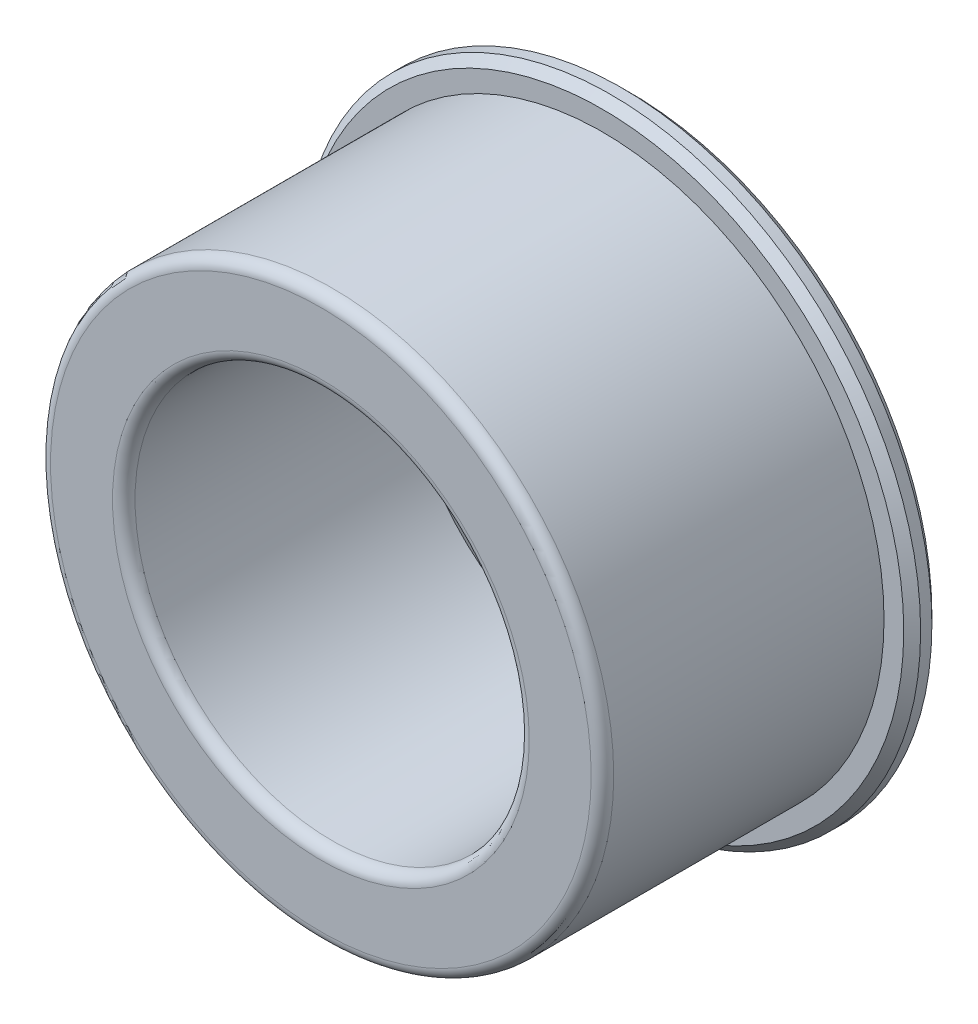
ISO-10303-21;
HEADER;
FILE_DESCRIPTION(('STEP AP214'),'2;1');
FILE_NAME('part.step','',(''),(''),'','','');
FILE_SCHEMA(('AUTOMOTIVE_DESIGN { 1 0 10303 214 1 1 1 1 }'));
ENDSEC;
DATA;
#1=APPLICATION_CONTEXT('core data for automotive mechanical design processes');
#2=APPLICATION_PROTOCOL_DEFINITION('international standard','automotive_design',2000,#1);
#3=PRODUCT_CONTEXT('',#1,'mechanical');
#4=PRODUCT('Part','Part','',(#3));
#5=PRODUCT_RELATED_PRODUCT_CATEGORY('part','',(#4));
#6=PRODUCT_DEFINITION_FORMATION('','',#4);
#7=PRODUCT_DEFINITION_CONTEXT('part definition',#1,'design');
#8=PRODUCT_DEFINITION('design','',#6,#7);
#9=PRODUCT_DEFINITION_SHAPE('','',#8);
#10=(LENGTH_UNIT() NAMED_UNIT(*) SI_UNIT(.MILLI.,.METRE.));
#11=(NAMED_UNIT(*) PLANE_ANGLE_UNIT() SI_UNIT($,.RADIAN.));
#12=(NAMED_UNIT(*) SI_UNIT($,.STERADIAN.) SOLID_ANGLE_UNIT());
#13=UNCERTAINTY_MEASURE_WITH_UNIT(LENGTH_MEASURE(1.E-05),#10,'distance_accuracy_value','');
#14=(GEOMETRIC_REPRESENTATION_CONTEXT(3) GLOBAL_UNCERTAINTY_ASSIGNED_CONTEXT((#13)) GLOBAL_UNIT_ASSIGNED_CONTEXT((#10,
#11,#12)) REPRESENTATION_CONTEXT('',''));
#15=CARTESIAN_POINT('',(0.,0.,0.));
#16=DIRECTION('',(0.,0.,1.));
#17=DIRECTION('',(1.,0.,0.));
#18=AXIS2_PLACEMENT_3D('',#15,#16,#17);
#19=CARTESIAN_POINT('',(0.,0.,10.));
#20=DIRECTION('',(0.,0.,-1.));
#21=DIRECTION('',(-1.,0.,0.));
#22=AXIS2_PLACEMENT_3D('',#19,#20,#21);
#23=CYLINDRICAL_SURFACE('',#22,7.);
#24=CARTESIAN_POINT('',(0.,0.,9.6));
#25=DIRECTION('',(0.,0.,1.));
#26=DIRECTION('',(1.,0.,0.));
#27=AXIS2_PLACEMENT_3D('',#24,#25,#26);
#28=CIRCLE('',#27,7.);
#29=CARTESIAN_POINT('',(7.,0.,9.6));
#30=VERTEX_POINT('',#29);
#31=EDGE_CURVE('E53',#30,#30,#28,.T.);
#32=ORIENTED_EDGE('',*,*,#31,.T.);
#33=EDGE_LOOP('',(#32));
#34=FACE_BOUND('',#33,.T.);
#35=CARTESIAN_POINT('',(0.,0.,0.));
#36=DIRECTION('',(0.,0.,1.));
#37=DIRECTION('',(1.,0.,0.));
#38=AXIS2_PLACEMENT_3D('',#35,#36,#37);
#39=CIRCLE('',#38,7.);
#40=CARTESIAN_POINT('',(7.,0.,0.));
#41=VERTEX_POINT('',#40);
#42=EDGE_CURVE('E56',#41,#41,#39,.F.);
#43=ORIENTED_EDGE('',*,*,#42,.T.);
#44=EDGE_LOOP('',(#43));
#45=FACE_BOUND('',#44,.T.);
#46=ADVANCED_FACE('F39',(#34,#45),#23,.F.);
#47=CARTESIAN_POINT('',(0.,0.,10.));
#48=DIRECTION('',(0.,0.,-1.));
#49=DIRECTION('',(-1.,0.,0.));
#50=AXIS2_PLACEMENT_3D('',#47,#48,#49);
#51=CYLINDRICAL_SURFACE('',#50,10.);
#52=CARTESIAN_POINT('',(0.,0.,9.6));
#53=DIRECTION('',(0.,0.,1.));
#54=DIRECTION('',(1.,0.,0.));
#55=AXIS2_PLACEMENT_3D('',#52,#53,#54);
#56=CIRCLE('',#55,10.);
#57=CARTESIAN_POINT('',(10.,0.,9.6));
#58=VERTEX_POINT('',#57);
#59=EDGE_CURVE('E10',#58,#58,#56,.F.);
#60=ORIENTED_EDGE('',*,*,#59,.T.);
#61=EDGE_LOOP('',(#60));
#62=FACE_BOUND('',#61,.T.);
#63=CARTESIAN_POINT('',(0.,0.,0.));
#64=DIRECTION('',(0.,0.,1.));
#65=DIRECTION('',(1.,0.,0.));
#66=AXIS2_PLACEMENT_3D('',#63,#64,#65);
#67=CIRCLE('',#66,10.);
#68=CARTESIAN_POINT('',(10.,0.,0.));
#69=VERTEX_POINT('',#68);
#70=EDGE_CURVE('E79',#69,#69,#67,.T.);
#71=ORIENTED_EDGE('',*,*,#70,.T.);
#72=EDGE_LOOP('',(#71));
#73=FACE_BOUND('',#72,.T.);
#74=ADVANCED_FACE('F83',(#62,#73),#51,.T.);
#75=CARTESIAN_POINT('',(0.,0.,10.));
#76=DIRECTION('',(0.,0.,1.));
#77=DIRECTION('',(1.,0.,0.));
#78=AXIS2_PLACEMENT_3D('',#75,#76,#77);
#79=PLANE('',#78);
#80=CARTESIAN_POINT('',(0.,0.,10.));
#81=DIRECTION('',(0.,0.,1.));
#82=DIRECTION('',(1.,0.,0.));
#83=AXIS2_PLACEMENT_3D('',#80,#81,#82);
#84=CIRCLE('',#83,7.4);
#85=CARTESIAN_POINT('',(7.4,0.,10.));
#86=VERTEX_POINT('',#85);
#87=EDGE_CURVE('E46',#86,#86,#84,.F.);
#88=ORIENTED_EDGE('',*,*,#87,.T.);
#89=EDGE_LOOP('',(#88));
#90=FACE_BOUND('',#89,.T.);
#91=CARTESIAN_POINT('',(0.,0.,10.));
#92=DIRECTION('',(0.,0.,1.));
#93=DIRECTION('',(1.,0.,0.));
#94=AXIS2_PLACEMENT_3D('',#91,#92,#93);
#95=CIRCLE('',#94,9.6);
#96=CARTESIAN_POINT('',(9.6,0.,10.));
#97=VERTEX_POINT('',#96);
#98=EDGE_CURVE('E49',#97,#97,#95,.T.);
#99=ORIENTED_EDGE('',*,*,#98,.T.);
#100=EDGE_LOOP('',(#99));
#101=FACE_BOUND('',#100,.T.);
#102=ADVANCED_FACE('F110',(#90,#101),#79,.T.);
#103=CARTESIAN_POINT('',(0.,0.,-1.));
#104=DIRECTION('',(0.,0.,1.));
#105=DIRECTION('',(1.,0.,0.));
#106=AXIS2_PLACEMENT_3D('',#103,#104,#105);
#107=CYLINDRICAL_SURFACE('',#106,11.);
#108=CARTESIAN_POINT('',(0.,0.,-0.700000000000007));
#109=DIRECTION('',(0.,0.,1.));
#110=DIRECTION('',(1.,0.,0.));
#111=AXIS2_PLACEMENT_3D('',#108,#109,#110);
#112=CIRCLE('',#111,11.);
#113=CARTESIAN_POINT('',(11.,0.,-0.700000000000007));
#114=VERTEX_POINT('',#113);
#115=EDGE_CURVE('E66',#114,#114,#112,.T.);
#116=ORIENTED_EDGE('',*,*,#115,.T.);
#117=EDGE_LOOP('',(#116));
#118=FACE_BOUND('',#117,.T.);
#119=CARTESIAN_POINT('',(0.,0.,-0.300000000000007));
#120=DIRECTION('',(0.,0.,1.));
#121=DIRECTION('',(1.,0.,0.));
#122=AXIS2_PLACEMENT_3D('',#119,#120,#121);
#123=CIRCLE('',#122,11.);
#124=CARTESIAN_POINT('',(11.,0.,-0.300000000000007));
#125=VERTEX_POINT('',#124);
#126=EDGE_CURVE('E72',#125,#125,#123,.F.);
#127=ORIENTED_EDGE('',*,*,#126,.T.);
#128=EDGE_LOOP('',(#127));
#129=FACE_BOUND('',#128,.T.);
#130=ADVANCED_FACE('F96',(#118,#129),#107,.T.);
#131=CARTESIAN_POINT('',(0.,0.,-1.));
#132=DIRECTION('',(0.,0.,1.));
#133=DIRECTION('',(1.,0.,0.));
#134=AXIS2_PLACEMENT_3D('',#131,#132,#133);
#135=PLANE('',#134);
#136=CARTESIAN_POINT('',(0.,0.,-1.));
#137=DIRECTION('',(0.,0.,1.));
#138=DIRECTION('',(1.,0.,0.));
#139=AXIS2_PLACEMENT_3D('',#136,#137,#138);
#140=CIRCLE('',#139,8.);
#141=CARTESIAN_POINT('',(8.,0.,-1.));
#142=VERTEX_POINT('',#141);
#143=EDGE_CURVE('E64',#142,#142,#140,.T.);
#144=ORIENTED_EDGE('',*,*,#143,.T.);
#145=EDGE_LOOP('',(#144));
#146=FACE_BOUND('',#145,.T.);
#147=CARTESIAN_POINT('',(0.,0.,-1.));
#148=DIRECTION('',(0.,0.,1.));
#149=DIRECTION('',(1.,0.,0.));
#150=AXIS2_PLACEMENT_3D('',#147,#148,#149);
#151=CIRCLE('',#150,10.7);
#152=CARTESIAN_POINT('',(10.7,0.,-1.));
#153=VERTEX_POINT('',#152);
#154=EDGE_CURVE('E61',#153,#153,#151,.F.);
#155=ORIENTED_EDGE('',*,*,#154,.T.);
#156=EDGE_LOOP('',(#155));
#157=FACE_BOUND('',#156,.T.);
#158=ADVANCED_FACE('F88',(#146,#157),#135,.F.);
#159=CARTESIAN_POINT('',(0.,0.,0.));
#160=DIRECTION('',(0.,0.,1.));
#161=DIRECTION('',(1.,0.,0.));
#162=AXIS2_PLACEMENT_3D('',#159,#160,#161);
#163=PLANE('',#162);
#164=CARTESIAN_POINT('',(0.,0.,0.));
#165=DIRECTION('',(0.,0.,1.));
#166=DIRECTION('',(1.,0.,0.));
#167=AXIS2_PLACEMENT_3D('',#164,#165,#166);
#168=CIRCLE('',#167,10.7);
#169=CARTESIAN_POINT('',(10.7,0.,0.));
#170=VERTEX_POINT('',#169);
#171=EDGE_CURVE('E74',#170,#170,#168,.T.);
#172=ORIENTED_EDGE('',*,*,#171,.T.);
#173=EDGE_LOOP('',(#172));
#174=FACE_BOUND('',#173,.T.);
#175=ORIENTED_EDGE('',*,*,#70,.F.);
#176=EDGE_LOOP('',(#175));
#177=FACE_BOUND('',#176,.T.);
#178=ADVANCED_FACE('F81',(#174,#177),#163,.T.);
#179=CARTESIAN_POINT('',(0.,0.,0.));
#180=DIRECTION('',(0.,0.,-1.));
#181=DIRECTION('',(-1.,0.,0.));
#182=AXIS2_PLACEMENT_3D('',#179,#180,#181);
#183=CONICAL_SURFACE('',#182,10.7,0.785398163397443);
#184=ORIENTED_EDGE('',*,*,#126,.F.);
#185=EDGE_LOOP('',(#184));
#186=FACE_BOUND('',#185,.T.);
#187=ORIENTED_EDGE('',*,*,#171,.F.);
#188=EDGE_LOOP('',(#187));
#189=FACE_BOUND('',#188,.T.);
#190=ADVANCED_FACE('F84',(#186,#189),#183,.T.);
#191=CARTESIAN_POINT('',(0.,0.,-0.700000000000007));
#192=DIRECTION('',(0.,0.,1.));
#193=DIRECTION('',(1.,0.,0.));
#194=AXIS2_PLACEMENT_3D('',#191,#192,#193);
#195=CONICAL_SURFACE('',#194,11.,0.785398163397454);
#196=ORIENTED_EDGE('',*,*,#154,.F.);
#197=EDGE_LOOP('',(#196));
#198=FACE_BOUND('',#197,.T.);
#199=ORIENTED_EDGE('',*,*,#115,.F.);
#200=EDGE_LOOP('',(#199));
#201=FACE_BOUND('',#200,.T.);
#202=ADVANCED_FACE('F95',(#198,#201),#195,.T.);
#203=CARTESIAN_POINT('',(0.,0.,-0.999999999999999));
#204=DIRECTION('',(0.,0.,-1.));
#205=DIRECTION('',(-1.,0.,0.));
#206=AXIS2_PLACEMENT_3D('',#203,#204,#205);
#207=CONICAL_SURFACE('',#206,8.,0.785398163397447);
#208=ORIENTED_EDGE('',*,*,#42,.F.);
#209=EDGE_LOOP('',(#208));
#210=FACE_BOUND('',#209,.T.);
#211=ORIENTED_EDGE('',*,*,#143,.F.);
#212=EDGE_LOOP('',(#211));
#213=FACE_BOUND('',#212,.T.);
#214=ADVANCED_FACE('F123',(#210,#213),#207,.F.);
#215=CARTESIAN_POINT('',(0.,0.,9.6));
#216=DIRECTION('',(0.,0.,1.));
#217=DIRECTION('',(1.,0.,0.));
#218=AXIS2_PLACEMENT_3D('',#215,#216,#217);
#219=TOROIDAL_SURFACE('',#218,7.4,0.4);
#220=ORIENTED_EDGE('',*,*,#87,.F.);
#221=EDGE_LOOP('',(#220));
#222=FACE_BOUND('',#221,.T.);
#223=ORIENTED_EDGE('',*,*,#31,.F.);
#224=EDGE_LOOP('',(#223));
#225=FACE_BOUND('',#224,.T.);
#226=ADVANCED_FACE('F124',(#222,#225),#219,.T.);
#227=CARTESIAN_POINT('',(0.,0.,9.6));
#228=DIRECTION('',(0.,0.,1.));
#229=DIRECTION('',(1.,0.,0.));
#230=AXIS2_PLACEMENT_3D('',#227,#228,#229);
#231=TOROIDAL_SURFACE('',#230,9.6,0.4);
#232=ORIENTED_EDGE('',*,*,#59,.F.);
#233=EDGE_LOOP('',(#232));
#234=FACE_BOUND('',#233,.T.);
#235=ORIENTED_EDGE('',*,*,#98,.F.);
#236=EDGE_LOOP('',(#235));
#237=FACE_BOUND('',#236,.T.);
#238=ADVANCED_FACE('F41',(#234,#237),#231,.T.);
#239=CLOSED_SHELL('',(#46,#74,#102,#130,#158,#178,#190,#202,#214,#226,#238));
#240=MANIFOLD_SOLID_BREP('B2',#239);
#241=ADVANCED_BREP_SHAPE_REPRESENTATION('',(#18,#240),#14);
#242=SHAPE_DEFINITION_REPRESENTATION(#9,#241);
ENDSEC;
END-ISO-10303-21;
